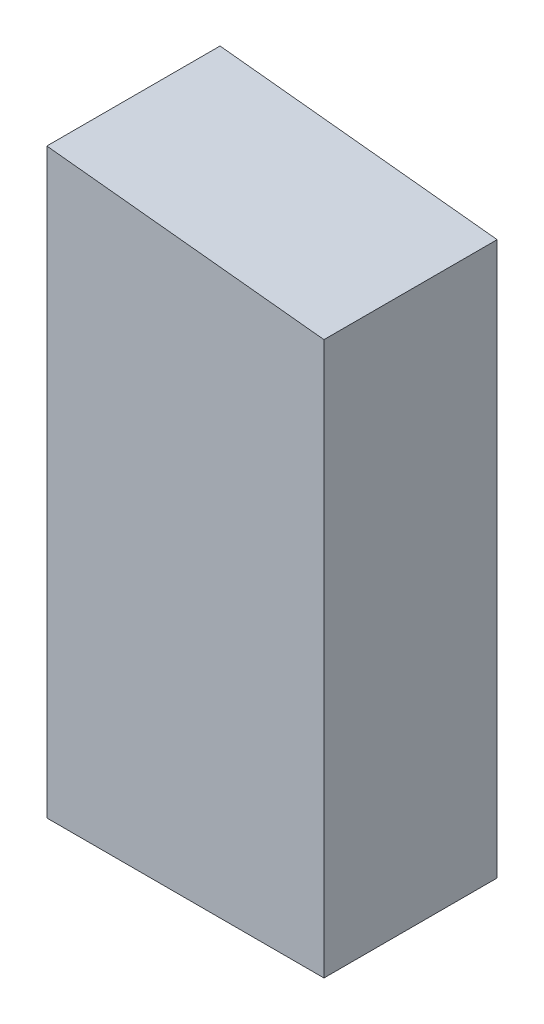
ISO-10303-21;
HEADER;
FILE_DESCRIPTION(('STEP AP214'),'2;1');
FILE_NAME('part.step','',(''),(''),'','','');
FILE_SCHEMA(('AUTOMOTIVE_DESIGN { 1 0 10303 214 1 1 1 1 }'));
ENDSEC;
DATA;
#1=APPLICATION_CONTEXT('core data for automotive mechanical design processes');
#2=APPLICATION_PROTOCOL_DEFINITION('international standard','automotive_design',2000,#1);
#3=PRODUCT_CONTEXT('',#1,'mechanical');
#4=PRODUCT('Part','Part','',(#3));
#5=PRODUCT_RELATED_PRODUCT_CATEGORY('part','',(#4));
#6=PRODUCT_DEFINITION_FORMATION('','',#4);
#7=PRODUCT_DEFINITION_CONTEXT('part definition',#1,'design');
#8=PRODUCT_DEFINITION('design','',#6,#7);
#9=PRODUCT_DEFINITION_SHAPE('','',#8);
#10=(LENGTH_UNIT() NAMED_UNIT(*) SI_UNIT(.MILLI.,.METRE.));
#11=(NAMED_UNIT(*) PLANE_ANGLE_UNIT() SI_UNIT($,.RADIAN.));
#12=(NAMED_UNIT(*) SI_UNIT($,.STERADIAN.) SOLID_ANGLE_UNIT());
#13=UNCERTAINTY_MEASURE_WITH_UNIT(LENGTH_MEASURE(1.E-05),#10,'distance_accuracy_value','');
#14=(GEOMETRIC_REPRESENTATION_CONTEXT(3) GLOBAL_UNCERTAINTY_ASSIGNED_CONTEXT((#13)) GLOBAL_UNIT_ASSIGNED_CONTEXT((#10,
#11,#12)) REPRESENTATION_CONTEXT('',''));
#15=CARTESIAN_POINT('',(0.,0.,0.));
#16=DIRECTION('',(0.,0.,1.));
#17=DIRECTION('',(1.,0.,0.));
#18=AXIS2_PLACEMENT_3D('',#15,#16,#17);
#19=CARTESIAN_POINT('',(0.,0.,25.));
#20=DIRECTION('',(1.,0.,0.));
#21=DIRECTION('',(0.,0.,-1.));
#22=AXIS2_PLACEMENT_3D('',#19,#20,#21);
#23=PLANE('',#22);
#24=DIRECTION('',(0.,-1.,0.));
#25=VECTOR('',#24,1.);
#26=CARTESIAN_POINT('',(0.,0.,0.));
#27=LINE('',#26,#25);
#28=CARTESIAN_POINT('',(0.,84.,0.));
#29=VERTEX_POINT('',#28);
#30=CARTESIAN_POINT('',(0.,0.,0.));
#31=VERTEX_POINT('',#30);
#32=EDGE_CURVE('E78',#29,#31,#27,.T.);
#33=ORIENTED_EDGE('',*,*,#32,.T.);
#34=DIRECTION('',(0.,0.,-1.));
#35=VECTOR('',#34,1.);
#36=CARTESIAN_POINT('',(0.,0.,25.));
#37=LINE('',#36,#35);
#38=CARTESIAN_POINT('',(0.,0.,25.));
#39=VERTEX_POINT('',#38);
#40=EDGE_CURVE('E11',#39,#31,#37,.T.);
#41=ORIENTED_EDGE('',*,*,#40,.F.);
#42=DIRECTION('',(0.,-1.,0.));
#43=VECTOR('',#42,1.);
#44=CARTESIAN_POINT('',(0.,0.,25.));
#45=LINE('',#44,#43);
#46=CARTESIAN_POINT('',(0.,84.,25.));
#47=VERTEX_POINT('',#46);
#48=EDGE_CURVE('E88',#47,#39,#45,.T.);
#49=ORIENTED_EDGE('',*,*,#48,.F.);
#50=DIRECTION('',(0.,0.,-1.));
#51=VECTOR('',#50,1.);
#52=CARTESIAN_POINT('',(0.,84.,25.));
#53=LINE('',#52,#51);
#54=EDGE_CURVE('E84',#47,#29,#53,.T.);
#55=ORIENTED_EDGE('',*,*,#54,.T.);
#56=EDGE_LOOP('',(#33,#41,#49,#55));
#57=FACE_BOUND('',#56,.T.);
#58=ADVANCED_FACE('F32',(#57),#23,.F.);
#59=CARTESIAN_POINT('',(0.,0.,25.));
#60=DIRECTION('',(0.,1.,0.));
#61=DIRECTION('',(0.,0.,1.));
#62=AXIS2_PLACEMENT_3D('',#59,#60,#61);
#63=PLANE('',#62);
#64=DIRECTION('',(1.,0.,0.));
#65=VECTOR('',#64,1.);
#66=CARTESIAN_POINT('',(0.,0.,0.));
#67=LINE('',#66,#65);
#68=CARTESIAN_POINT('',(40.,0.,0.));
#69=VERTEX_POINT('',#68);
#70=EDGE_CURVE('E68',#31,#69,#67,.T.);
#71=ORIENTED_EDGE('',*,*,#70,.T.);
#72=DIRECTION('',(0.,0.,-1.));
#73=VECTOR('',#72,1.);
#74=CARTESIAN_POINT('',(40.,0.,25.));
#75=LINE('',#74,#73);
#76=CARTESIAN_POINT('',(40.,0.,25.));
#77=VERTEX_POINT('',#76);
#78=EDGE_CURVE('E40',#77,#69,#75,.T.);
#79=ORIENTED_EDGE('',*,*,#78,.F.);
#80=DIRECTION('',(1.,0.,0.));
#81=VECTOR('',#80,1.);
#82=CARTESIAN_POINT('',(0.,0.,25.));
#83=LINE('',#82,#81);
#84=EDGE_CURVE('E57',#39,#77,#83,.T.);
#85=ORIENTED_EDGE('',*,*,#84,.F.);
#86=ORIENTED_EDGE('',*,*,#40,.T.);
#87=EDGE_LOOP('',(#71,#79,#85,#86));
#88=FACE_BOUND('',#87,.T.);
#89=ADVANCED_FACE('F70',(#88),#63,.F.);
#90=CARTESIAN_POINT('',(40.,0.,25.));
#91=DIRECTION('',(-1.,0.,0.));
#92=DIRECTION('',(0.,0.,1.));
#93=AXIS2_PLACEMENT_3D('',#90,#91,#92);
#94=PLANE('',#93);
#95=DIRECTION('',(0.,1.,0.));
#96=VECTOR('',#95,1.);
#97=CARTESIAN_POINT('',(40.,0.,0.));
#98=LINE('',#97,#96);
#99=CARTESIAN_POINT('',(40.,79.7958305893732,0.));
#100=VERTEX_POINT('',#99);
#101=EDGE_CURVE('E77',#69,#100,#98,.T.);
#102=ORIENTED_EDGE('',*,*,#101,.T.);
#103=DIRECTION('',(0.,0.,1.));
#104=VECTOR('',#103,1.);
#105=CARTESIAN_POINT('',(40.,79.7958305893732,0.));
#106=LINE('',#105,#104);
#107=CARTESIAN_POINT('',(40.,79.7958305893732,25.));
#108=VERTEX_POINT('',#107);
#109=EDGE_CURVE('E48',#100,#108,#106,.T.);
#110=ORIENTED_EDGE('',*,*,#109,.T.);
#111=DIRECTION('',(0.,1.,0.));
#112=VECTOR('',#111,1.);
#113=CARTESIAN_POINT('',(40.,0.,25.));
#114=LINE('',#113,#112);
#115=EDGE_CURVE('E83',#77,#108,#114,.T.);
#116=ORIENTED_EDGE('',*,*,#115,.F.);
#117=ORIENTED_EDGE('',*,*,#78,.T.);
#118=EDGE_LOOP('',(#102,#110,#116,#117));
#119=FACE_BOUND('',#118,.T.);
#120=ADVANCED_FACE('F82',(#119),#94,.F.);
#121=CARTESIAN_POINT('',(0.,0.,25.));
#122=DIRECTION('',(0.,0.,-1.));
#123=DIRECTION('',(-1.,0.,0.));
#124=AXIS2_PLACEMENT_3D('',#121,#122,#123);
#125=PLANE('',#124);
#126=ORIENTED_EDGE('',*,*,#115,.T.);
#127=DIRECTION('',(-0.994521895368274,0.104528463267647,0.));
#128=VECTOR('',#127,1.);
#129=CARTESIAN_POINT('',(8.73229101434532,83.08219923082,25.));
#130=LINE('',#129,#128);
#131=EDGE_CURVE('E103',#108,#47,#130,.T.);
#132=ORIENTED_EDGE('',*,*,#131,.T.);
#133=ORIENTED_EDGE('',*,*,#48,.T.);
#134=ORIENTED_EDGE('',*,*,#84,.T.);
#135=EDGE_LOOP('',(#126,#132,#133,#134));
#136=FACE_BOUND('',#135,.T.);
#137=ADVANCED_FACE('F117',(#136),#125,.F.);
#138=CARTESIAN_POINT('',(0.,0.,0.));
#139=DIRECTION('',(0.,0.,-1.));
#140=DIRECTION('',(-1.,0.,0.));
#141=AXIS2_PLACEMENT_3D('',#138,#139,#140);
#142=PLANE('',#141);
#143=DIRECTION('',(0.994521895368274,-0.104528463267647,0.));
#144=VECTOR('',#143,1.);
#145=CARTESIAN_POINT('',(40.,79.7958305893732,0.));
#146=LINE('',#145,#144);
#147=EDGE_CURVE('E87',#29,#100,#146,.T.);
#148=ORIENTED_EDGE('',*,*,#147,.T.);
#149=ORIENTED_EDGE('',*,*,#101,.F.);
#150=ORIENTED_EDGE('',*,*,#70,.F.);
#151=ORIENTED_EDGE('',*,*,#32,.F.);
#152=EDGE_LOOP('',(#148,#149,#150,#151));
#153=FACE_BOUND('',#152,.T.);
#154=ADVANCED_FACE('F86',(#153),#142,.T.);
#155=CARTESIAN_POINT('',(40.,79.7958305893732,0.));
#156=DIRECTION('',(-0.104528463267647,-0.994521895368274,0.));
#157=DIRECTION('',(0.994521895368274,-0.104528463267647,0.));
#158=AXIS2_PLACEMENT_3D('',#155,#156,#157);
#159=PLANE('',#158);
#160=ORIENTED_EDGE('',*,*,#109,.F.);
#161=ORIENTED_EDGE('',*,*,#147,.F.);
#162=ORIENTED_EDGE('',*,*,#54,.F.);
#163=ORIENTED_EDGE('',*,*,#131,.F.);
#164=EDGE_LOOP('',(#160,#161,#162,#163));
#165=FACE_BOUND('',#164,.T.);
#166=ADVANCED_FACE('F111',(#165),#159,.F.);
#167=CLOSED_SHELL('',(#58,#89,#120,#137,#154,#166));
#168=MANIFOLD_SOLID_BREP('B2',#167);
#169=ADVANCED_BREP_SHAPE_REPRESENTATION('',(#18,#168),#14);
#170=SHAPE_DEFINITION_REPRESENTATION(#9,#169);
ENDSEC;
END-ISO-10303-21;
